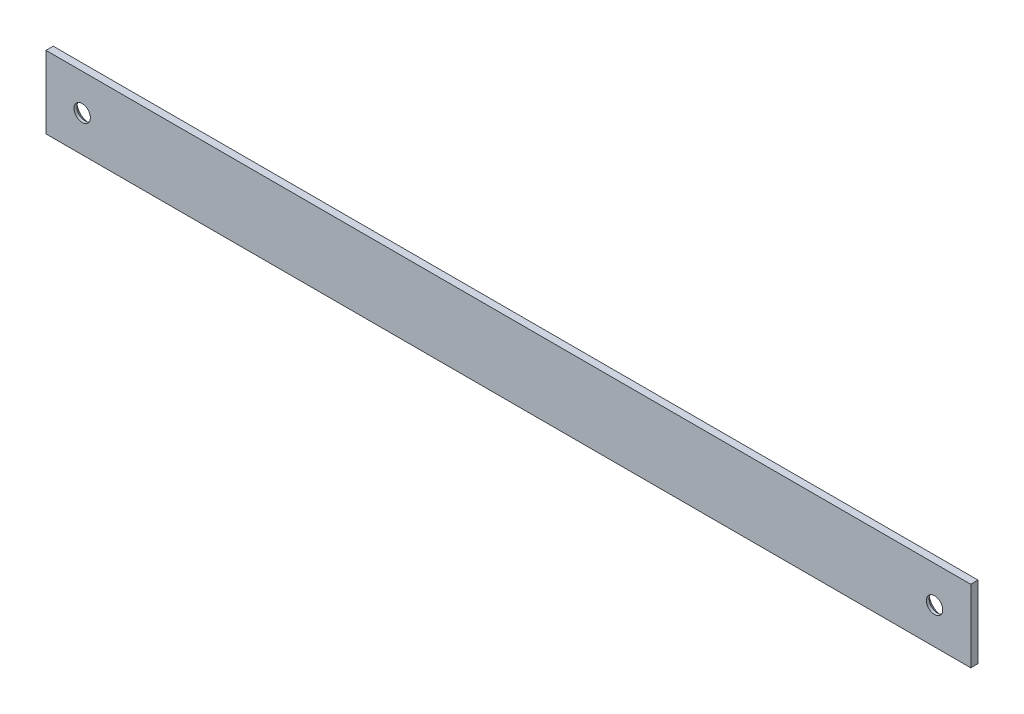
ISO-10303-21;
HEADER;
FILE_DESCRIPTION(('STEP AP214'),'2;1');
FILE_NAME('part.step','',(''),(''),'','','');
FILE_SCHEMA(('AUTOMOTIVE_DESIGN { 1 0 10303 214 1 1 1 1 }'));
ENDSEC;
DATA;
#1=APPLICATION_CONTEXT('core data for automotive mechanical design processes');
#2=APPLICATION_PROTOCOL_DEFINITION('international standard','automotive_design',2000,#1);
#3=PRODUCT_CONTEXT('',#1,'mechanical');
#4=PRODUCT('Part','Part','',(#3));
#5=PRODUCT_RELATED_PRODUCT_CATEGORY('part','',(#4));
#6=PRODUCT_DEFINITION_FORMATION('','',#4);
#7=PRODUCT_DEFINITION_CONTEXT('part definition',#1,'design');
#8=PRODUCT_DEFINITION('design','',#6,#7);
#9=PRODUCT_DEFINITION_SHAPE('','',#8);
#10=(LENGTH_UNIT() NAMED_UNIT(*) SI_UNIT(.MILLI.,.METRE.));
#11=(NAMED_UNIT(*) PLANE_ANGLE_UNIT() SI_UNIT($,.RADIAN.));
#12=(NAMED_UNIT(*) SI_UNIT($,.STERADIAN.) SOLID_ANGLE_UNIT());
#13=UNCERTAINTY_MEASURE_WITH_UNIT(LENGTH_MEASURE(1.E-05),#10,'distance_accuracy_value','');
#14=(GEOMETRIC_REPRESENTATION_CONTEXT(3) GLOBAL_UNCERTAINTY_ASSIGNED_CONTEXT((#13)) GLOBAL_UNIT_ASSIGNED_CONTEXT((#10,
#11,#12)) REPRESENTATION_CONTEXT('',''));
#15=CARTESIAN_POINT('',(0.,0.,0.));
#16=DIRECTION('',(0.,0.,1.));
#17=DIRECTION('',(1.,0.,0.));
#18=AXIS2_PLACEMENT_3D('',#15,#16,#17);
#19=CARTESIAN_POINT('',(0.,0.,0.));
#20=DIRECTION('',(0.,0.,1.));
#21=DIRECTION('',(1.,0.,0.));
#22=AXIS2_PLACEMENT_3D('',#19,#20,#21);
#23=PLANE('',#22);
#24=CARTESIAN_POINT('',(-112.1621709,0.,0.));
#25=DIRECTION('',(0.,0.,-1.));
#26=DIRECTION('',(-1.,0.,0.));
#27=AXIS2_PLACEMENT_3D('',#24,#25,#26);
#28=CIRCLE('',#27,3.32739999999999);
#29=CARTESIAN_POINT('',(-115.4895709,0.,0.));
#30=VERTEX_POINT('',#29);
#31=EDGE_CURVE('E124',#30,#30,#28,.T.);
#32=ORIENTED_EDGE('',*,*,#31,.F.);
#33=EDGE_LOOP('',(#32));
#34=FACE_BOUND('',#33,.T.);
#35=DIRECTION('',(0.,-1.,0.));
#36=VECTOR('',#35,1.);
#37=CARTESIAN_POINT('',(-121.6871709,9.525,0.));
#38=LINE('',#37,#36);
#39=CARTESIAN_POINT('',(-121.6871709,9.525,0.));
#40=VERTEX_POINT('',#39);
#41=CARTESIAN_POINT('',(-121.6871709,-9.525,0.));
#42=VERTEX_POINT('',#41);
#43=EDGE_CURVE('E105',#40,#42,#38,.T.);
#44=ORIENTED_EDGE('',*,*,#43,.F.);
#45=DIRECTION('',(-1.,0.,0.));
#46=VECTOR('',#45,1.);
#47=CARTESIAN_POINT('',(-121.6871709,9.525,0.));
#48=LINE('',#47,#46);
#49=CARTESIAN_POINT('',(121.6871709,9.52499999999999,0.));
#50=VERTEX_POINT('',#49);
#51=EDGE_CURVE('E81',#50,#40,#48,.T.);
#52=ORIENTED_EDGE('',*,*,#51,.F.);
#53=DIRECTION('',(0.,1.,0.));
#54=VECTOR('',#53,1.);
#55=CARTESIAN_POINT('',(121.6871709,9.52499999999999,0.));
#56=LINE('',#55,#54);
#57=CARTESIAN_POINT('',(121.6871709,-9.52499999999999,0.));
#58=VERTEX_POINT('',#57);
#59=EDGE_CURVE('E75',#58,#50,#56,.T.);
#60=ORIENTED_EDGE('',*,*,#59,.F.);
#61=DIRECTION('',(1.,0.,0.));
#62=VECTOR('',#61,1.);
#63=CARTESIAN_POINT('',(-121.6871709,-9.525,0.));
#64=LINE('',#63,#62);
#65=EDGE_CURVE('E97',#42,#58,#64,.T.);
#66=ORIENTED_EDGE('',*,*,#65,.F.);
#67=EDGE_LOOP('',(#44,#52,#60,#66));
#68=FACE_BOUND('',#67,.T.);
#69=CARTESIAN_POINT('',(112.1621709,0.,0.));
#70=DIRECTION('',(0.,0.,-1.));
#71=DIRECTION('',(-1.,0.,0.));
#72=AXIS2_PLACEMENT_3D('',#69,#70,#71);
#73=CIRCLE('',#72,3.32739999999999);
#74=CARTESIAN_POINT('',(108.8347709,0.,0.));
#75=VERTEX_POINT('',#74);
#76=EDGE_CURVE('E133',#75,#75,#73,.T.);
#77=ORIENTED_EDGE('',*,*,#76,.F.);
#78=EDGE_LOOP('',(#77));
#79=FACE_BOUND('',#78,.T.);
#80=ADVANCED_FACE('F41',(#34,#68,#79),#23,.F.);
#81=CARTESIAN_POINT('',(-121.6871709,9.525,1.905));
#82=DIRECTION('',(1.,0.,0.));
#83=DIRECTION('',(0.,0.,-1.));
#84=AXIS2_PLACEMENT_3D('',#81,#82,#83);
#85=PLANE('',#84);
#86=ORIENTED_EDGE('',*,*,#43,.T.);
#87=DIRECTION('',(0.,0.,-1.));
#88=VECTOR('',#87,1.);
#89=CARTESIAN_POINT('',(-121.6871709,-9.525,1.905));
#90=LINE('',#89,#88);
#91=CARTESIAN_POINT('',(-121.6871709,-9.525,1.905));
#92=VERTEX_POINT('',#91);
#93=EDGE_CURVE('E11',#92,#42,#90,.T.);
#94=ORIENTED_EDGE('',*,*,#93,.F.);
#95=DIRECTION('',(0.,-1.,0.));
#96=VECTOR('',#95,1.);
#97=CARTESIAN_POINT('',(-121.6871709,9.525,1.905));
#98=LINE('',#97,#96);
#99=CARTESIAN_POINT('',(-121.6871709,9.525,1.905));
#100=VERTEX_POINT('',#99);
#101=EDGE_CURVE('E93',#100,#92,#98,.T.);
#102=ORIENTED_EDGE('',*,*,#101,.F.);
#103=DIRECTION('',(0.,0.,-1.));
#104=VECTOR('',#103,1.);
#105=CARTESIAN_POINT('',(-121.6871709,9.525,1.905));
#106=LINE('',#105,#104);
#107=EDGE_CURVE('E101',#100,#40,#106,.T.);
#108=ORIENTED_EDGE('',*,*,#107,.T.);
#109=EDGE_LOOP('',(#86,#94,#102,#108));
#110=FACE_BOUND('',#109,.T.);
#111=ADVANCED_FACE('F43',(#110),#85,.F.);
#112=CARTESIAN_POINT('',(-121.6871709,-9.525,1.905));
#113=DIRECTION('',(0.,1.,0.));
#114=DIRECTION('',(-1.,0.,0.));
#115=AXIS2_PLACEMENT_3D('',#112,#113,#114);
#116=PLANE('',#115);
#117=ORIENTED_EDGE('',*,*,#65,.T.);
#118=DIRECTION('',(0.,0.,-1.));
#119=VECTOR('',#118,1.);
#120=CARTESIAN_POINT('',(121.6871709,-9.52499999999999,1.905));
#121=LINE('',#120,#119);
#122=CARTESIAN_POINT('',(121.6871709,-9.52499999999999,1.905));
#123=VERTEX_POINT('',#122);
#124=EDGE_CURVE('E50',#123,#58,#121,.T.);
#125=ORIENTED_EDGE('',*,*,#124,.F.);
#126=DIRECTION('',(1.,0.,0.));
#127=VECTOR('',#126,1.);
#128=CARTESIAN_POINT('',(-121.6871709,-9.525,1.905));
#129=LINE('',#128,#127);
#130=EDGE_CURVE('E88',#92,#123,#129,.T.);
#131=ORIENTED_EDGE('',*,*,#130,.F.);
#132=ORIENTED_EDGE('',*,*,#93,.T.);
#133=EDGE_LOOP('',(#117,#125,#131,#132));
#134=FACE_BOUND('',#133,.T.);
#135=ADVANCED_FACE('F96',(#134),#116,.F.);
#136=CARTESIAN_POINT('',(121.6871709,9.52499999999999,1.905));
#137=DIRECTION('',(-1.,0.,0.));
#138=DIRECTION('',(0.,0.,1.));
#139=AXIS2_PLACEMENT_3D('',#136,#137,#138);
#140=PLANE('',#139);
#141=ORIENTED_EDGE('',*,*,#59,.T.);
#142=DIRECTION('',(0.,0.,-1.));
#143=VECTOR('',#142,1.);
#144=CARTESIAN_POINT('',(121.6871709,9.52499999999999,1.905));
#145=LINE('',#144,#143);
#146=CARTESIAN_POINT('',(121.6871709,9.52499999999999,1.905));
#147=VERTEX_POINT('',#146);
#148=EDGE_CURVE('E98',#147,#50,#145,.T.);
#149=ORIENTED_EDGE('',*,*,#148,.F.);
#150=DIRECTION('',(0.,1.,0.));
#151=VECTOR('',#150,1.);
#152=CARTESIAN_POINT('',(121.6871709,9.52499999999999,1.905));
#153=LINE('',#152,#151);
#154=EDGE_CURVE('E91',#123,#147,#153,.T.);
#155=ORIENTED_EDGE('',*,*,#154,.F.);
#156=ORIENTED_EDGE('',*,*,#124,.T.);
#157=EDGE_LOOP('',(#141,#149,#155,#156));
#158=FACE_BOUND('',#157,.T.);
#159=ADVANCED_FACE('F99',(#158),#140,.F.);
#160=CARTESIAN_POINT('',(-121.6871709,9.525,1.905));
#161=DIRECTION('',(0.,-1.,0.));
#162=DIRECTION('',(1.,0.,0.));
#163=AXIS2_PLACEMENT_3D('',#160,#161,#162);
#164=PLANE('',#163);
#165=ORIENTED_EDGE('',*,*,#51,.T.);
#166=ORIENTED_EDGE('',*,*,#107,.F.);
#167=DIRECTION('',(-1.,0.,0.));
#168=VECTOR('',#167,1.);
#169=CARTESIAN_POINT('',(-121.6871709,9.525,1.905));
#170=LINE('',#169,#168);
#171=EDGE_CURVE('E58',#147,#100,#170,.T.);
#172=ORIENTED_EDGE('',*,*,#171,.F.);
#173=ORIENTED_EDGE('',*,*,#148,.T.);
#174=EDGE_LOOP('',(#165,#166,#172,#173));
#175=FACE_BOUND('',#174,.T.);
#176=ADVANCED_FACE('F113',(#175),#164,.F.);
#177=CARTESIAN_POINT('',(0.,0.,1.905));
#178=DIRECTION('',(0.,0.,1.));
#179=DIRECTION('',(1.,0.,0.));
#180=AXIS2_PLACEMENT_3D('',#177,#178,#179);
#181=PLANE('',#180);
#182=CARTESIAN_POINT('',(112.1621709,0.,1.905));
#183=DIRECTION('',(0.,0.,1.));
#184=DIRECTION('',(1.,0.,0.));
#185=AXIS2_PLACEMENT_3D('',#182,#183,#184);
#186=CIRCLE('',#185,2.15265000000001);
#187=CARTESIAN_POINT('',(114.3148209,0.,1.905));
#188=VERTEX_POINT('',#187);
#189=EDGE_CURVE('E127',#188,#188,#186,.T.);
#190=ORIENTED_EDGE('',*,*,#189,.F.);
#191=EDGE_LOOP('',(#190));
#192=FACE_BOUND('',#191,.T.);
#193=CARTESIAN_POINT('',(-112.1621709,0.,1.905));
#194=DIRECTION('',(0.,0.,1.));
#195=DIRECTION('',(1.,0.,0.));
#196=AXIS2_PLACEMENT_3D('',#193,#194,#195);
#197=CIRCLE('',#196,2.15265000000001);
#198=CARTESIAN_POINT('',(-110.0095209,0.,1.905));
#199=VERTEX_POINT('',#198);
#200=EDGE_CURVE('E108',#199,#199,#197,.T.);
#201=ORIENTED_EDGE('',*,*,#200,.F.);
#202=EDGE_LOOP('',(#201));
#203=FACE_BOUND('',#202,.T.);
#204=ORIENTED_EDGE('',*,*,#101,.T.);
#205=ORIENTED_EDGE('',*,*,#130,.T.);
#206=ORIENTED_EDGE('',*,*,#154,.T.);
#207=ORIENTED_EDGE('',*,*,#171,.T.);
#208=EDGE_LOOP('',(#204,#205,#206,#207));
#209=FACE_BOUND('',#208,.T.);
#210=ADVANCED_FACE('F89',(#192,#203,#209),#181,.T.);
#211=CARTESIAN_POINT('',(-112.1621709,0.,0.));
#212=DIRECTION('',(0.,0.,-1.));
#213=DIRECTION('',(-1.,0.,0.));
#214=AXIS2_PLACEMENT_3D('',#211,#212,#213);
#215=CYLINDRICAL_SURFACE('',#214,2.15265000000001);
#216=CARTESIAN_POINT('',(-112.1621709,0.,1.17475));
#217=DIRECTION('',(0.,0.,-1.));
#218=DIRECTION('',(-1.,0.,0.));
#219=AXIS2_PLACEMENT_3D('',#216,#217,#218);
#220=CIRCLE('',#219,2.15265000000001);
#221=CARTESIAN_POINT('',(-114.3148209,0.,1.17475));
#222=VERTEX_POINT('',#221);
#223=EDGE_CURVE('E121',#222,#222,#220,.T.);
#224=ORIENTED_EDGE('',*,*,#223,.T.);
#225=EDGE_LOOP('',(#224));
#226=FACE_BOUND('',#225,.T.);
#227=ORIENTED_EDGE('',*,*,#200,.T.);
#228=EDGE_LOOP('',(#227));
#229=FACE_BOUND('',#228,.T.);
#230=ADVANCED_FACE('F176',(#226,#229),#215,.F.);
#231=CARTESIAN_POINT('',(-112.1621709,0.,0.));
#232=DIRECTION('',(0.,0.,-1.));
#233=DIRECTION('',(-1.,0.,0.));
#234=AXIS2_PLACEMENT_3D('',#231,#232,#233);
#235=CONICAL_SURFACE('',#234,3.32739999999999,0.785398163397443);
#236=ORIENTED_EDGE('',*,*,#223,.F.);
#237=EDGE_LOOP('',(#236));
#238=FACE_BOUND('',#237,.T.);
#239=ORIENTED_EDGE('',*,*,#31,.T.);
#240=EDGE_LOOP('',(#239));
#241=FACE_BOUND('',#240,.T.);
#242=ADVANCED_FACE('F189',(#238,#241),#235,.F.);
#243=CARTESIAN_POINT('',(112.1621709,0.,0.));
#244=DIRECTION('',(0.,0.,-1.));
#245=DIRECTION('',(-1.,0.,0.));
#246=AXIS2_PLACEMENT_3D('',#243,#244,#245);
#247=CYLINDRICAL_SURFACE('',#246,2.15265000000001);
#248=CARTESIAN_POINT('',(112.1621709,0.,1.17475));
#249=DIRECTION('',(0.,0.,-1.));
#250=DIRECTION('',(-1.,0.,0.));
#251=AXIS2_PLACEMENT_3D('',#248,#249,#250);
#252=CIRCLE('',#251,2.15265000000001);
#253=CARTESIAN_POINT('',(110.0095209,0.,1.17475));
#254=VERTEX_POINT('',#253);
#255=EDGE_CURVE('E130',#254,#254,#252,.T.);
#256=ORIENTED_EDGE('',*,*,#255,.T.);
#257=EDGE_LOOP('',(#256));
#258=FACE_BOUND('',#257,.T.);
#259=ORIENTED_EDGE('',*,*,#189,.T.);
#260=EDGE_LOOP('',(#259));
#261=FACE_BOUND('',#260,.T.);
#262=ADVANCED_FACE('F198',(#258,#261),#247,.F.);
#263=CARTESIAN_POINT('',(112.1621709,0.,0.));
#264=DIRECTION('',(0.,0.,-1.));
#265=DIRECTION('',(-1.,0.,0.));
#266=AXIS2_PLACEMENT_3D('',#263,#264,#265);
#267=CONICAL_SURFACE('',#266,3.32739999999999,0.785398163397443);
#268=ORIENTED_EDGE('',*,*,#255,.F.);
#269=EDGE_LOOP('',(#268));
#270=FACE_BOUND('',#269,.T.);
#271=ORIENTED_EDGE('',*,*,#76,.T.);
#272=EDGE_LOOP('',(#271));
#273=FACE_BOUND('',#272,.T.);
#274=ADVANCED_FACE('F137',(#270,#273),#267,.F.);
#275=CLOSED_SHELL('',(#80,#111,#135,#159,#176,#210,#230,#242,#262,#274));
#276=MANIFOLD_SOLID_BREP('B2',#275);
#277=ADVANCED_BREP_SHAPE_REPRESENTATION('',(#18,#276),#14);
#278=SHAPE_DEFINITION_REPRESENTATION(#9,#277);
ENDSEC;
END-ISO-10303-21;
